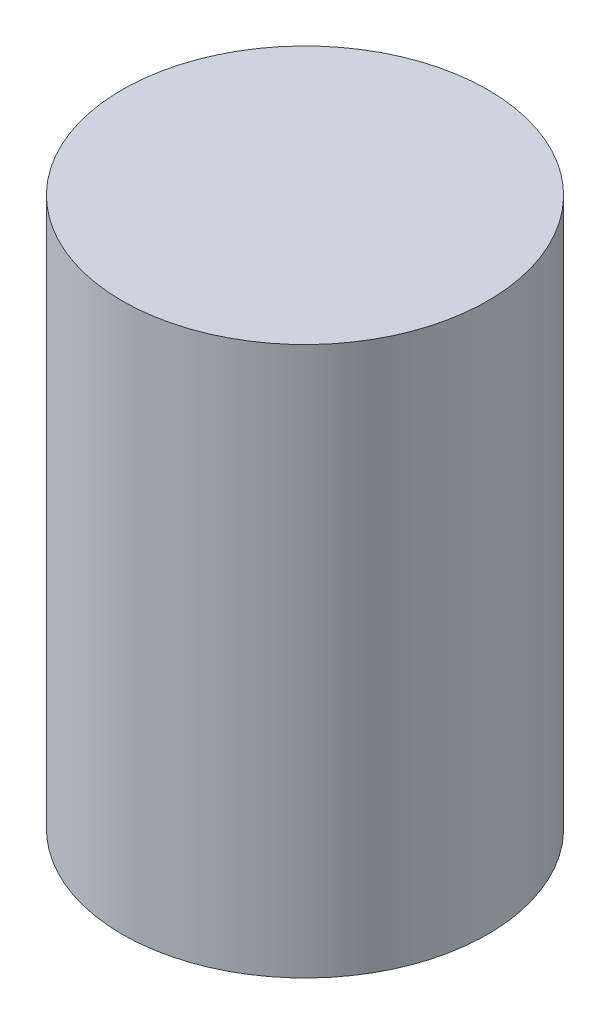
ISO-10303-21;
HEADER;
FILE_DESCRIPTION(('STEP AP214'),'2;1');
FILE_NAME('part.step','',(''),(''),'','','');
FILE_SCHEMA(('AUTOMOTIVE_DESIGN { 1 0 10303 214 1 1 1 1 }'));
ENDSEC;
DATA;
#1=APPLICATION_CONTEXT('core data for automotive mechanical design processes');
#2=APPLICATION_PROTOCOL_DEFINITION('international standard','automotive_design',2000,#1);
#3=PRODUCT_CONTEXT('',#1,'mechanical');
#4=PRODUCT('Part','Part','',(#3));
#5=PRODUCT_RELATED_PRODUCT_CATEGORY('part','',(#4));
#6=PRODUCT_DEFINITION_FORMATION('','',#4);
#7=PRODUCT_DEFINITION_CONTEXT('part definition',#1,'design');
#8=PRODUCT_DEFINITION('design','',#6,#7);
#9=PRODUCT_DEFINITION_SHAPE('','',#8);
#10=(LENGTH_UNIT() NAMED_UNIT(*) SI_UNIT(.MILLI.,.METRE.));
#11=(NAMED_UNIT(*) PLANE_ANGLE_UNIT() SI_UNIT($,.RADIAN.));
#12=(NAMED_UNIT(*) SI_UNIT($,.STERADIAN.) SOLID_ANGLE_UNIT());
#13=UNCERTAINTY_MEASURE_WITH_UNIT(LENGTH_MEASURE(1.E-05),#10,'distance_accuracy_value','');
#14=(GEOMETRIC_REPRESENTATION_CONTEXT(3) GLOBAL_UNCERTAINTY_ASSIGNED_CONTEXT((#13)) GLOBAL_UNIT_ASSIGNED_CONTEXT((#10,
#11,#12)) REPRESENTATION_CONTEXT('',''));
#15=CARTESIAN_POINT('',(0.,0.,0.));
#16=DIRECTION('',(0.,0.,1.));
#17=DIRECTION('',(1.,0.,0.));
#18=AXIS2_PLACEMENT_3D('',#15,#16,#17);
#19=CARTESIAN_POINT('',(185.,1770.,-300.));
#20=DIRECTION('',(0.,-1.,0.));
#21=DIRECTION('',(0.,0.,-1.));
#22=AXIS2_PLACEMENT_3D('',#19,#20,#21);
#23=CYLINDRICAL_SURFACE('',#22,150.);
#24=CARTESIAN_POINT('',(185.,1770.,-300.));
#25=DIRECTION('',(0.,1.,0.));
#26=DIRECTION('',(0.,0.,1.));
#27=AXIS2_PLACEMENT_3D('',#24,#25,#26);
#28=CIRCLE('',#27,150.);
#29=CARTESIAN_POINT('',(185.,1770.,-150.));
#30=VERTEX_POINT('',#29);
#31=EDGE_CURVE('E10',#30,#30,#28,.T.);
#32=ORIENTED_EDGE('',*,*,#31,.F.);
#33=EDGE_LOOP('',(#32));
#34=FACE_BOUND('',#33,.T.);
#35=CARTESIAN_POINT('',(185.,1320.,-300.));
#36=DIRECTION('',(0.,1.,0.));
#37=DIRECTION('',(0.,0.,1.));
#38=AXIS2_PLACEMENT_3D('',#35,#36,#37);
#39=CIRCLE('',#38,150.);
#40=CARTESIAN_POINT('',(185.,1320.,-150.));
#41=VERTEX_POINT('',#40);
#42=EDGE_CURVE('E40',#41,#41,#39,.T.);
#43=ORIENTED_EDGE('',*,*,#42,.T.);
#44=EDGE_LOOP('',(#43));
#45=FACE_BOUND('',#44,.T.);
#46=ADVANCED_FACE('F37',(#34,#45),#23,.T.);
#47=CARTESIAN_POINT('',(185.,1770.,-300.));
#48=DIRECTION('',(0.,1.,0.));
#49=DIRECTION('',(0.,0.,1.));
#50=AXIS2_PLACEMENT_3D('',#47,#48,#49);
#51=PLANE('',#50);
#52=ORIENTED_EDGE('',*,*,#31,.T.);
#53=EDGE_LOOP('',(#52));
#54=FACE_BOUND('',#53,.T.);
#55=ADVANCED_FACE('F52',(#54),#51,.T.);
#56=CARTESIAN_POINT('',(185.,1320.,-300.));
#57=DIRECTION('',(0.,1.,0.));
#58=DIRECTION('',(0.,0.,1.));
#59=AXIS2_PLACEMENT_3D('',#56,#57,#58);
#60=PLANE('',#59);
#61=ORIENTED_EDGE('',*,*,#42,.F.);
#62=EDGE_LOOP('',(#61));
#63=FACE_BOUND('',#62,.T.);
#64=ADVANCED_FACE('F50',(#63),#60,.F.);
#65=CLOSED_SHELL('',(#46,#55,#64));
#66=MANIFOLD_SOLID_BREP('B2',#65);
#67=ADVANCED_BREP_SHAPE_REPRESENTATION('',(#18,#66),#14);
#68=SHAPE_DEFINITION_REPRESENTATION(#9,#67);
ENDSEC;
END-ISO-10303-21;
